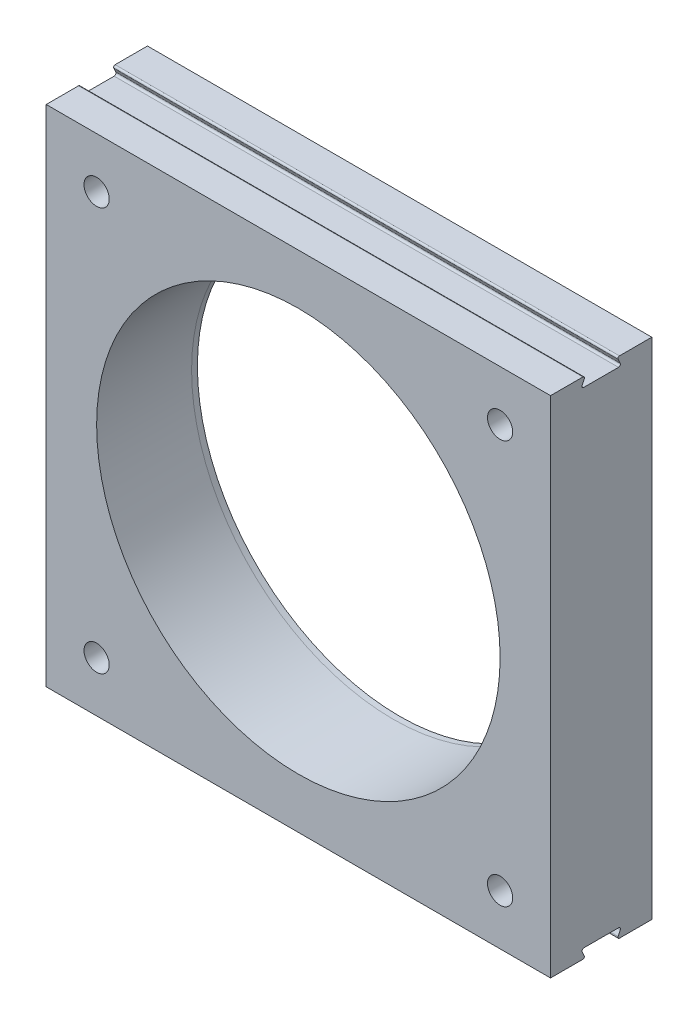
ISO-10303-21;
HEADER;
FILE_DESCRIPTION(('STEP AP214'),'2;1');
FILE_NAME('part.step','',(''),(''),'','','');
FILE_SCHEMA(('AUTOMOTIVE_DESIGN { 1 0 10303 214 1 1 1 1 }'));
ENDSEC;
DATA;
#1=APPLICATION_CONTEXT('core data for automotive mechanical design processes');
#2=APPLICATION_PROTOCOL_DEFINITION('international standard','automotive_design',2000,#1);
#3=PRODUCT_CONTEXT('',#1,'mechanical');
#4=PRODUCT('Part','Part','',(#3));
#5=PRODUCT_RELATED_PRODUCT_CATEGORY('part','',(#4));
#6=PRODUCT_DEFINITION_FORMATION('','',#4);
#7=PRODUCT_DEFINITION_CONTEXT('part definition',#1,'design');
#8=PRODUCT_DEFINITION('design','',#6,#7);
#9=PRODUCT_DEFINITION_SHAPE('','',#8);
#10=(LENGTH_UNIT() NAMED_UNIT(*) SI_UNIT(.MILLI.,.METRE.));
#11=(NAMED_UNIT(*) PLANE_ANGLE_UNIT() SI_UNIT($,.RADIAN.));
#12=(NAMED_UNIT(*) SI_UNIT($,.STERADIAN.) SOLID_ANGLE_UNIT());
#13=UNCERTAINTY_MEASURE_WITH_UNIT(LENGTH_MEASURE(1.E-05),#10,'distance_accuracy_value','');
#14=(GEOMETRIC_REPRESENTATION_CONTEXT(3) GLOBAL_UNCERTAINTY_ASSIGNED_CONTEXT((#13)) GLOBAL_UNIT_ASSIGNED_CONTEXT((#10,
#11,#12)) REPRESENTATION_CONTEXT('',''));
#15=CARTESIAN_POINT('',(0.,0.,0.));
#16=DIRECTION('',(0.,0.,1.));
#17=DIRECTION('',(1.,0.,0.));
#18=AXIS2_PLACEMENT_3D('',#15,#16,#17);
#19=CARTESIAN_POINT('',(-127.,-127.,25.5));
#20=DIRECTION('',(0.,0.,-1.));
#21=DIRECTION('',(-1.,0.,0.));
#22=AXIS2_PLACEMENT_3D('',#19,#20,#21);
#23=PLANE('',#22);
#24=CARTESIAN_POINT('',(0.,0.,25.5));
#25=DIRECTION('',(0.,0.,-1.));
#26=DIRECTION('',(-1.,0.,0.));
#27=AXIS2_PLACEMENT_3D('',#24,#25,#26);
#28=CIRCLE('',#27,101.6);
#29=CARTESIAN_POINT('',(-101.6,0.,25.5));
#30=VERTEX_POINT('',#29);
#31=EDGE_CURVE('E610',#30,#30,#28,.T.);
#32=ORIENTED_EDGE('',*,*,#31,.T.);
#33=EDGE_LOOP('',(#32));
#34=FACE_BOUND('',#33,.T.);
#35=CARTESIAN_POINT('',(101.6,-101.6,25.5));
#36=DIRECTION('',(0.,0.,1.));
#37=DIRECTION('',(-1.,0.,0.));
#38=AXIS2_PLACEMENT_3D('',#35,#36,#37);
#39=CIRCLE('',#38,6.34999999999999);
#40=CARTESIAN_POINT('',(95.25,-101.6,25.5));
#41=VERTEX_POINT('',#40);
#42=EDGE_CURVE('E581',#41,#41,#39,.T.);
#43=ORIENTED_EDGE('',*,*,#42,.F.);
#44=EDGE_LOOP('',(#43));
#45=FACE_BOUND('',#44,.T.);
#46=CARTESIAN_POINT('',(-101.6,-101.6,25.5));
#47=DIRECTION('',(0.,0.,-1.));
#48=DIRECTION('',(1.,0.,0.));
#49=AXIS2_PLACEMENT_3D('',#46,#47,#48);
#50=CIRCLE('',#49,6.34999999999999);
#51=CARTESIAN_POINT('',(-95.25,-101.6,25.5));
#52=VERTEX_POINT('',#51);
#53=EDGE_CURVE('E578',#52,#52,#50,.T.);
#54=ORIENTED_EDGE('',*,*,#53,.T.);
#55=EDGE_LOOP('',(#54));
#56=FACE_BOUND('',#55,.T.);
#57=CARTESIAN_POINT('',(-101.6,101.6,25.5));
#58=DIRECTION('',(0.,0.,1.));
#59=DIRECTION('',(1.,0.,0.));
#60=AXIS2_PLACEMENT_3D('',#57,#58,#59);
#61=CIRCLE('',#60,6.34999999999999);
#62=CARTESIAN_POINT('',(-95.25,101.6,25.5));
#63=VERTEX_POINT('',#62);
#64=EDGE_CURVE('E193',#63,#63,#61,.T.);
#65=ORIENTED_EDGE('',*,*,#64,.F.);
#66=EDGE_LOOP('',(#65));
#67=FACE_BOUND('',#66,.T.);
#68=DIRECTION('',(0.,-1.,0.));
#69=VECTOR('',#68,1.);
#70=CARTESIAN_POINT('',(-127.,127.,25.5));
#71=LINE('',#70,#69);
#72=CARTESIAN_POINT('',(-127.,127.,25.5));
#73=VERTEX_POINT('',#72);
#74=CARTESIAN_POINT('',(-127.,-127.,25.5));
#75=VERTEX_POINT('',#74);
#76=EDGE_CURVE('E274',#73,#75,#71,.T.);
#77=ORIENTED_EDGE('',*,*,#76,.T.);
#78=DIRECTION('',(-1.,0.,0.));
#79=VECTOR('',#78,1.);
#80=CARTESIAN_POINT('',(127.,-127.,25.5));
#81=LINE('',#80,#79);
#82=CARTESIAN_POINT('',(127.,-127.,25.5));
#83=VERTEX_POINT('',#82);
#84=EDGE_CURVE('E276',#83,#75,#81,.T.);
#85=ORIENTED_EDGE('',*,*,#84,.F.);
#86=DIRECTION('',(0.,1.,0.));
#87=VECTOR('',#86,1.);
#88=CARTESIAN_POINT('',(127.,-127.,25.5));
#89=LINE('',#88,#87);
#90=CARTESIAN_POINT('',(127.,127.,25.5));
#91=VERTEX_POINT('',#90);
#92=EDGE_CURVE('E280',#83,#91,#89,.T.);
#93=ORIENTED_EDGE('',*,*,#92,.T.);
#94=DIRECTION('',(1.,0.,0.));
#95=VECTOR('',#94,1.);
#96=CARTESIAN_POINT('',(-127.,127.,25.5));
#97=LINE('',#96,#95);
#98=EDGE_CURVE('E282',#73,#91,#97,.T.);
#99=ORIENTED_EDGE('',*,*,#98,.F.);
#100=EDGE_LOOP('',(#77,#85,#93,#99));
#101=FACE_BOUND('',#100,.T.);
#102=CARTESIAN_POINT('',(101.6,101.6,25.5));
#103=DIRECTION('',(0.,0.,-1.));
#104=DIRECTION('',(-1.,0.,0.));
#105=AXIS2_PLACEMENT_3D('',#102,#103,#104);
#106=CIRCLE('',#105,6.34999999999999);
#107=CARTESIAN_POINT('',(95.25,101.6,25.5));
#108=VERTEX_POINT('',#107);
#109=EDGE_CURVE('E572',#108,#108,#106,.T.);
#110=ORIENTED_EDGE('',*,*,#109,.T.);
#111=EDGE_LOOP('',(#110));
#112=FACE_BOUND('',#111,.T.);
#113=ADVANCED_FACE('F32',(#34,#45,#56,#67,#101,#112),#23,.F.);
#114=CARTESIAN_POINT('',(-127.,-127.,-25.5));
#115=DIRECTION('',(0.,0.,-1.));
#116=DIRECTION('',(-1.,0.,0.));
#117=AXIS2_PLACEMENT_3D('',#114,#115,#116);
#118=PLANE('',#117);
#119=CARTESIAN_POINT('',(0.,0.,-25.5));
#120=DIRECTION('',(0.,0.,-1.));
#121=DIRECTION('',(-1.,0.,0.));
#122=AXIS2_PLACEMENT_3D('',#119,#120,#121);
#123=CIRCLE('',#122,101.85);
#124=CARTESIAN_POINT('',(-101.85,0.,-25.5));
#125=VERTEX_POINT('',#124);
#126=EDGE_CURVE('E603',#125,#125,#123,.T.);
#127=ORIENTED_EDGE('',*,*,#126,.F.);
#128=EDGE_LOOP('',(#127));
#129=FACE_BOUND('',#128,.T.);
#130=CARTESIAN_POINT('',(101.6,-101.6,-25.5));
#131=DIRECTION('',(0.,0.,1.));
#132=DIRECTION('',(-1.,0.,0.));
#133=AXIS2_PLACEMENT_3D('',#130,#131,#132);
#134=CIRCLE('',#133,6.34999999999999);
#135=CARTESIAN_POINT('',(95.25,-101.6,-25.5));
#136=VERTEX_POINT('',#135);
#137=EDGE_CURVE('E575',#136,#136,#134,.T.);
#138=ORIENTED_EDGE('',*,*,#137,.T.);
#139=EDGE_LOOP('',(#138));
#140=FACE_BOUND('',#139,.T.);
#141=CARTESIAN_POINT('',(-101.6,-101.6,-25.5));
#142=DIRECTION('',(0.,0.,-1.));
#143=DIRECTION('',(1.,0.,0.));
#144=AXIS2_PLACEMENT_3D('',#141,#142,#143);
#145=CIRCLE('',#144,6.34999999999999);
#146=CARTESIAN_POINT('',(-95.25,-101.6,-25.5));
#147=VERTEX_POINT('',#146);
#148=EDGE_CURVE('E585',#147,#147,#145,.T.);
#149=ORIENTED_EDGE('',*,*,#148,.F.);
#150=EDGE_LOOP('',(#149));
#151=FACE_BOUND('',#150,.T.);
#152=CARTESIAN_POINT('',(-101.6,101.6,-25.5));
#153=DIRECTION('',(0.,0.,1.));
#154=DIRECTION('',(1.,0.,0.));
#155=AXIS2_PLACEMENT_3D('',#152,#153,#154);
#156=CIRCLE('',#155,6.34999999999999);
#157=CARTESIAN_POINT('',(-95.25,101.6,-25.5));
#158=VERTEX_POINT('',#157);
#159=EDGE_CURVE('E190',#158,#158,#156,.T.);
#160=ORIENTED_EDGE('',*,*,#159,.T.);
#161=EDGE_LOOP('',(#160));
#162=FACE_BOUND('',#161,.T.);
#163=DIRECTION('',(0.,-1.,0.));
#164=VECTOR('',#163,1.);
#165=CARTESIAN_POINT('',(-127.,127.,-25.5));
#166=LINE('',#165,#164);
#167=CARTESIAN_POINT('',(-127.,127.,-25.5));
#168=VERTEX_POINT('',#167);
#169=CARTESIAN_POINT('',(-127.,-127.,-25.5));
#170=VERTEX_POINT('',#169);
#171=EDGE_CURVE('E267',#168,#170,#166,.T.);
#172=ORIENTED_EDGE('',*,*,#171,.F.);
#173=DIRECTION('',(1.,0.,0.));
#174=VECTOR('',#173,1.);
#175=CARTESIAN_POINT('',(-127.,127.,-25.5));
#176=LINE('',#175,#174);
#177=CARTESIAN_POINT('',(127.,127.,-25.5));
#178=VERTEX_POINT('',#177);
#179=EDGE_CURVE('E277',#168,#178,#176,.T.);
#180=ORIENTED_EDGE('',*,*,#179,.T.);
#181=DIRECTION('',(0.,1.,0.));
#182=VECTOR('',#181,1.);
#183=CARTESIAN_POINT('',(127.,-127.,-25.5));
#184=LINE('',#183,#182);
#185=CARTESIAN_POINT('',(127.,-127.,-25.5));
#186=VERTEX_POINT('',#185);
#187=EDGE_CURVE('E290',#186,#178,#184,.T.);
#188=ORIENTED_EDGE('',*,*,#187,.F.);
#189=DIRECTION('',(-1.,0.,0.));
#190=VECTOR('',#189,1.);
#191=CARTESIAN_POINT('',(127.,-127.,-25.5));
#192=LINE('',#191,#190);
#193=EDGE_CURVE('E287',#186,#170,#192,.T.);
#194=ORIENTED_EDGE('',*,*,#193,.T.);
#195=EDGE_LOOP('',(#172,#180,#188,#194));
#196=FACE_BOUND('',#195,.T.);
#197=CARTESIAN_POINT('',(101.6,101.6,-25.5));
#198=DIRECTION('',(0.,0.,-1.));
#199=DIRECTION('',(-1.,0.,0.));
#200=AXIS2_PLACEMENT_3D('',#197,#198,#199);
#201=CIRCLE('',#200,6.34999999999999);
#202=CARTESIAN_POINT('',(95.25,101.6,-25.5));
#203=VERTEX_POINT('',#202);
#204=EDGE_CURVE('E574',#203,#203,#201,.T.);
#205=ORIENTED_EDGE('',*,*,#204,.F.);
#206=EDGE_LOOP('',(#205));
#207=FACE_BOUND('',#206,.T.);
#208=ADVANCED_FACE('F336',(#129,#140,#151,#162,#196,#207),#118,.T.);
#209=CARTESIAN_POINT('',(-127.,127.,25.5));
#210=DIRECTION('',(1.,0.,0.));
#211=DIRECTION('',(0.,1.,0.));
#212=AXIS2_PLACEMENT_3D('',#209,#210,#211);
#213=PLANE('',#212);
#214=CARTESIAN_POINT('',(-127.,-126.20625,9.20803888963356));
#215=DIRECTION('',(-1.,0.,0.));
#216=DIRECTION('',(0.,-1.,0.));
#217=AXIS2_PLACEMENT_3D('',#214,#215,#216);
#218=CIRCLE('',#217,0.79375);
#219=CARTESIAN_POINT('',(-127.,-127.,9.20803888963356));
#220=VERTEX_POINT('',#219);
#221=CARTESIAN_POINT('',(-127.,-125.858154942476,8.49468841936867));
#222=VERTEX_POINT('',#221);
#223=EDGE_CURVE('E232',#220,#222,#218,.F.);
#224=ORIENTED_EDGE('',*,*,#223,.F.);
#225=DIRECTION('',(0.,0.,-1.));
#226=VECTOR('',#225,1.);
#227=CARTESIAN_POINT('',(-127.,-127.,25.5));
#228=LINE('',#227,#226);
#229=EDGE_CURVE('E306',#75,#220,#228,.T.);
#230=ORIENTED_EDGE('',*,*,#229,.F.);
#231=ORIENTED_EDGE('',*,*,#76,.F.);
#232=DIRECTION('',(0.,0.,-1.));
#233=VECTOR('',#232,1.);
#234=CARTESIAN_POINT('',(-127.,127.,25.5));
#235=LINE('',#234,#233);
#236=CARTESIAN_POINT('',(-127.,127.,9.20803888963356));
#237=VERTEX_POINT('',#236);
#238=EDGE_CURVE('E295',#73,#237,#235,.T.);
#239=ORIENTED_EDGE('',*,*,#238,.T.);
#240=CARTESIAN_POINT('',(-127.,126.20625,9.20803888963356));
#241=DIRECTION('',(1.,0.,0.));
#242=DIRECTION('',(0.,1.,0.));
#243=AXIS2_PLACEMENT_3D('',#240,#241,#242);
#244=CIRCLE('',#243,0.79375);
#245=CARTESIAN_POINT('',(-127.,125.858154942476,8.49468841936867));
#246=VERTEX_POINT('',#245);
#247=EDGE_CURVE('E319',#237,#246,#244,.F.);
#248=ORIENTED_EDGE('',*,*,#247,.T.);
#249=DIRECTION('',(0.,-0.898709253877024,0.438544954361354));
#250=VECTOR('',#249,1.);
#251=CARTESIAN_POINT('',(-127.,127.,7.9375));
#252=LINE('',#251,#250);
#253=CARTESIAN_POINT('',(-127.,123.612719874881,9.59039786599067));
#254=VERTEX_POINT('',#253);
#255=EDGE_CURVE('E240',#246,#254,#252,.T.);
#256=ORIENTED_EDGE('',*,*,#255,.T.);
#257=CARTESIAN_POINT('',(-127.,123.193479770192,8.73125));
#258=DIRECTION('',(1.,0.,0.));
#259=DIRECTION('',(0.,0.,-1.));
#260=AXIS2_PLACEMENT_3D('',#257,#258,#259);
#261=CIRCLE('',#260,0.955979770191875);
#262=CARTESIAN_POINT('',(-127.,122.2375,8.73125));
#263=VERTEX_POINT('',#262);
#264=EDGE_CURVE('E242',#254,#263,#261,.T.);
#265=ORIENTED_EDGE('',*,*,#264,.T.);
#266=DIRECTION('',(0.,0.,1.));
#267=VECTOR('',#266,1.);
#268=CARTESIAN_POINT('',(-127.,122.2375,-8.73125));
#269=LINE('',#268,#267);
#270=CARTESIAN_POINT('',(-127.,122.2375,-8.73125));
#271=VERTEX_POINT('',#270);
#272=EDGE_CURVE('E246',#271,#263,#269,.T.);
#273=ORIENTED_EDGE('',*,*,#272,.F.);
#274=CARTESIAN_POINT('',(-127.,123.193479770192,-8.73125));
#275=DIRECTION('',(-1.,0.,0.));
#276=DIRECTION('',(0.,0.,1.));
#277=AXIS2_PLACEMENT_3D('',#274,#275,#276);
#278=CIRCLE('',#277,0.955979770191875);
#279=CARTESIAN_POINT('',(-127.,123.612719874881,-9.59039786599068));
#280=VERTEX_POINT('',#279);
#281=EDGE_CURVE('E248',#280,#271,#278,.T.);
#282=ORIENTED_EDGE('',*,*,#281,.F.);
#283=DIRECTION('',(0.,-0.898709253877024,-0.438544954361354));
#284=VECTOR('',#283,1.);
#285=CARTESIAN_POINT('',(-127.,127.,-7.9375));
#286=LINE('',#285,#284);
#287=CARTESIAN_POINT('',(-127.,125.858154942476,-8.49468841936868));
#288=VERTEX_POINT('',#287);
#289=EDGE_CURVE('E250',#288,#280,#286,.T.);
#290=ORIENTED_EDGE('',*,*,#289,.F.);
#291=CARTESIAN_POINT('',(-127.,126.20625,-9.20803888963357));
#292=DIRECTION('',(1.,0.,0.));
#293=DIRECTION('',(0.,1.,0.));
#294=AXIS2_PLACEMENT_3D('',#291,#292,#293);
#295=CIRCLE('',#294,0.79375);
#296=CARTESIAN_POINT('',(-127.,127.,-9.20803888963357));
#297=VERTEX_POINT('',#296);
#298=EDGE_CURVE('E55',#288,#297,#295,.F.);
#299=ORIENTED_EDGE('',*,*,#298,.T.);
#300=EDGE_CURVE('E285',#297,#168,#235,.T.);
#301=ORIENTED_EDGE('',*,*,#300,.T.);
#302=ORIENTED_EDGE('',*,*,#171,.T.);
#303=CARTESIAN_POINT('',(-127.,-127.,-9.20803888963357));
#304=VERTEX_POINT('',#303);
#305=EDGE_CURVE('E189',#304,#170,#228,.T.);
#306=ORIENTED_EDGE('',*,*,#305,.F.);
#307=CARTESIAN_POINT('',(-127.,-126.20625,-9.20803888963357));
#308=DIRECTION('',(-1.,0.,0.));
#309=DIRECTION('',(0.,-1.,0.));
#310=AXIS2_PLACEMENT_3D('',#307,#308,#309);
#311=CIRCLE('',#310,0.79375);
#312=CARTESIAN_POINT('',(-127.,-125.858154942476,-8.49468841936868));
#313=VERTEX_POINT('',#312);
#314=EDGE_CURVE('E171',#313,#304,#311,.F.);
#315=ORIENTED_EDGE('',*,*,#314,.F.);
#316=DIRECTION('',(0.,0.898709253877024,-0.438544954361354));
#317=VECTOR('',#316,1.);
#318=CARTESIAN_POINT('',(-127.,-127.,-7.9375));
#319=LINE('',#318,#317);
#320=CARTESIAN_POINT('',(-127.,-123.612719874881,-9.59039786599068));
#321=VERTEX_POINT('',#320);
#322=EDGE_CURVE('E178',#313,#321,#319,.T.);
#323=ORIENTED_EDGE('',*,*,#322,.T.);
#324=CARTESIAN_POINT('',(-127.,-123.193479770192,-8.73125));
#325=DIRECTION('',(1.,0.,0.));
#326=DIRECTION('',(0.,0.,1.));
#327=AXIS2_PLACEMENT_3D('',#324,#325,#326);
#328=CIRCLE('',#327,0.955979770191875);
#329=CARTESIAN_POINT('',(-127.,-122.2375,-8.73125));
#330=VERTEX_POINT('',#329);
#331=EDGE_CURVE('E204',#321,#330,#328,.T.);
#332=ORIENTED_EDGE('',*,*,#331,.T.);
#333=DIRECTION('',(0.,0.,1.));
#334=VECTOR('',#333,1.);
#335=CARTESIAN_POINT('',(-127.,-122.2375,-8.73125));
#336=LINE('',#335,#334);
#337=CARTESIAN_POINT('',(-127.,-122.2375,8.73125));
#338=VERTEX_POINT('',#337);
#339=EDGE_CURVE('E211',#330,#338,#336,.T.);
#340=ORIENTED_EDGE('',*,*,#339,.T.);
#341=CARTESIAN_POINT('',(-127.,-123.193479770192,8.73125));
#342=DIRECTION('',(-1.,0.,0.));
#343=DIRECTION('',(0.,0.,-1.));
#344=AXIS2_PLACEMENT_3D('',#341,#342,#343);
#345=CIRCLE('',#344,0.955979770191875);
#346=CARTESIAN_POINT('',(-127.,-123.612719874881,9.59039786599067));
#347=VERTEX_POINT('',#346);
#348=EDGE_CURVE('E219',#347,#338,#345,.T.);
#349=ORIENTED_EDGE('',*,*,#348,.F.);
#350=DIRECTION('',(0.,0.898709253877024,0.438544954361354));
#351=VECTOR('',#350,1.);
#352=CARTESIAN_POINT('',(-127.,-127.,7.9375));
#353=LINE('',#352,#351);
#354=EDGE_CURVE('E224',#222,#347,#353,.T.);
#355=ORIENTED_EDGE('',*,*,#354,.F.);
#356=EDGE_LOOP('',(#224,#230,#231,#239,#248,#256,#265,#273,#282,#290,#299,#301,#302,#306,#315,
#323,#332,#340,#349,#355));
#357=FACE_BOUND('',#356,.T.);
#358=ADVANCED_FACE('F187',(#357),#213,.F.);
#359=CARTESIAN_POINT('',(127.,-127.,25.5));
#360=DIRECTION('',(0.,-1.,0.));
#361=DIRECTION('',(1.,0.,0.));
#362=AXIS2_PLACEMENT_3D('',#359,#360,#361);
#363=PLANE('',#362);
#364=DIRECTION('',(1.,0.,0.));
#365=VECTOR('',#364,1.);
#366=CARTESIAN_POINT('',(-127.,-127.,9.20803888963356));
#367=LINE('',#366,#365);
#368=CARTESIAN_POINT('',(127.,-127.,9.20803888963356));
#369=VERTEX_POINT('',#368);
#370=EDGE_CURVE('E235',#369,#220,#367,.F.);
#371=ORIENTED_EDGE('',*,*,#370,.F.);
#372=DIRECTION('',(0.,0.,-1.));
#373=VECTOR('',#372,1.);
#374=CARTESIAN_POINT('',(127.,-127.,25.5));
#375=LINE('',#374,#373);
#376=EDGE_CURVE('E303',#83,#369,#375,.T.);
#377=ORIENTED_EDGE('',*,*,#376,.F.);
#378=ORIENTED_EDGE('',*,*,#84,.T.);
#379=ORIENTED_EDGE('',*,*,#229,.T.);
#380=EDGE_LOOP('',(#371,#377,#378,#379));
#381=FACE_BOUND('',#380,.T.);
#382=ADVANCED_FACE('F343',(#381),#363,.T.);
#383=CARTESIAN_POINT('',(127.,-127.,25.5));
#384=DIRECTION('',(-1.,0.,0.));
#385=DIRECTION('',(0.,-1.,0.));
#386=AXIS2_PLACEMENT_3D('',#383,#384,#385);
#387=PLANE('',#386);
#388=CARTESIAN_POINT('',(127.,-126.20625,9.20803888963356));
#389=DIRECTION('',(1.,0.,0.));
#390=DIRECTION('',(0.,1.,0.));
#391=AXIS2_PLACEMENT_3D('',#388,#389,#390);
#392=CIRCLE('',#391,0.79375);
#393=CARTESIAN_POINT('',(127.,-125.858154942476,8.49468841936867));
#394=VERTEX_POINT('',#393);
#395=EDGE_CURVE('E237',#394,#369,#392,.F.);
#396=ORIENTED_EDGE('',*,*,#395,.F.);
#397=DIRECTION('',(0.,0.898709253877024,0.438544954361354));
#398=VECTOR('',#397,1.);
#399=CARTESIAN_POINT('',(127.,-127.,7.9375));
#400=LINE('',#399,#398);
#401=CARTESIAN_POINT('',(127.,-123.612719874881,9.59039786599067));
#402=VERTEX_POINT('',#401);
#403=EDGE_CURVE('E229',#394,#402,#400,.T.);
#404=ORIENTED_EDGE('',*,*,#403,.T.);
#405=CARTESIAN_POINT('',(127.,-123.193479770192,8.73125));
#406=DIRECTION('',(-1.,0.,0.));
#407=DIRECTION('',(0.,0.,-1.));
#408=AXIS2_PLACEMENT_3D('',#405,#406,#407);
#409=CIRCLE('',#408,0.955979770191875);
#410=CARTESIAN_POINT('',(127.,-122.2375,8.73125));
#411=VERTEX_POINT('',#410);
#412=EDGE_CURVE('E216',#402,#411,#409,.T.);
#413=ORIENTED_EDGE('',*,*,#412,.T.);
#414=DIRECTION('',(0.,0.,1.));
#415=VECTOR('',#414,1.);
#416=CARTESIAN_POINT('',(127.,-122.2375,-8.73125));
#417=LINE('',#416,#415);
#418=CARTESIAN_POINT('',(127.,-122.2375,-8.73125));
#419=VERTEX_POINT('',#418);
#420=EDGE_CURVE('E208',#419,#411,#417,.T.);
#421=ORIENTED_EDGE('',*,*,#420,.F.);
#422=CARTESIAN_POINT('',(127.,-123.193479770192,-8.73125));
#423=DIRECTION('',(1.,0.,0.));
#424=DIRECTION('',(0.,0.,1.));
#425=AXIS2_PLACEMENT_3D('',#422,#423,#424);
#426=CIRCLE('',#425,0.955979770191875);
#427=CARTESIAN_POINT('',(127.,-123.612719874881,-9.59039786599068));
#428=VERTEX_POINT('',#427);
#429=EDGE_CURVE('E201',#428,#419,#426,.T.);
#430=ORIENTED_EDGE('',*,*,#429,.F.);
#431=DIRECTION('',(0.,0.898709253877024,-0.438544954361354));
#432=VECTOR('',#431,1.);
#433=CARTESIAN_POINT('',(127.,-127.,-7.9375));
#434=LINE('',#433,#432);
#435=CARTESIAN_POINT('',(127.,-125.858154942476,-8.49468841936868));
#436=VERTEX_POINT('',#435);
#437=EDGE_CURVE('E183',#436,#428,#434,.T.);
#438=ORIENTED_EDGE('',*,*,#437,.F.);
#439=CARTESIAN_POINT('',(127.,-126.20625,-9.20803888963357));
#440=DIRECTION('',(1.,0.,0.));
#441=DIRECTION('',(0.,1.,0.));
#442=AXIS2_PLACEMENT_3D('',#439,#440,#441);
#443=CIRCLE('',#442,0.79375);
#444=CARTESIAN_POINT('',(127.,-127.,-9.20803888963357));
#445=VERTEX_POINT('',#444);
#446=EDGE_CURVE('E172',#445,#436,#443,.F.);
#447=ORIENTED_EDGE('',*,*,#446,.F.);
#448=EDGE_CURVE('E302',#445,#186,#375,.T.);
#449=ORIENTED_EDGE('',*,*,#448,.T.);
#450=ORIENTED_EDGE('',*,*,#187,.T.);
#451=DIRECTION('',(0.,0.,-1.));
#452=VECTOR('',#451,1.);
#453=CARTESIAN_POINT('',(127.,127.,25.5));
#454=LINE('',#453,#452);
#455=CARTESIAN_POINT('',(127.,127.,-9.20803888963357));
#456=VERTEX_POINT('',#455);
#457=EDGE_CURVE('E298',#456,#178,#454,.T.);
#458=ORIENTED_EDGE('',*,*,#457,.F.);
#459=CARTESIAN_POINT('',(127.,126.20625,-9.20803888963357));
#460=DIRECTION('',(-1.,0.,0.));
#461=DIRECTION('',(0.,-1.,0.));
#462=AXIS2_PLACEMENT_3D('',#459,#460,#461);
#463=CIRCLE('',#462,0.79375);
#464=CARTESIAN_POINT('',(127.,125.858154942476,-8.49468841936868));
#465=VERTEX_POINT('',#464);
#466=EDGE_CURVE('E312',#456,#465,#463,.F.);
#467=ORIENTED_EDGE('',*,*,#466,.T.);
#468=DIRECTION('',(0.,-0.898709253877024,-0.438544954361354));
#469=VECTOR('',#468,1.);
#470=CARTESIAN_POINT('',(127.,127.,-7.9375));
#471=LINE('',#470,#469);
#472=CARTESIAN_POINT('',(127.,123.612719874881,-9.59039786599068));
#473=VERTEX_POINT('',#472);
#474=EDGE_CURVE('E243',#465,#473,#471,.T.);
#475=ORIENTED_EDGE('',*,*,#474,.T.);
#476=CARTESIAN_POINT('',(127.,123.193479770192,-8.73125));
#477=DIRECTION('',(-1.,0.,0.));
#478=DIRECTION('',(0.,0.,1.));
#479=AXIS2_PLACEMENT_3D('',#476,#477,#478);
#480=CIRCLE('',#479,0.955979770191875);
#481=CARTESIAN_POINT('',(127.,122.2375,-8.73125));
#482=VERTEX_POINT('',#481);
#483=EDGE_CURVE('E260',#473,#482,#480,.T.);
#484=ORIENTED_EDGE('',*,*,#483,.T.);
#485=DIRECTION('',(0.,0.,1.));
#486=VECTOR('',#485,1.);
#487=CARTESIAN_POINT('',(127.,122.2375,-8.73125));
#488=LINE('',#487,#486);
#489=CARTESIAN_POINT('',(127.,122.2375,8.73125));
#490=VERTEX_POINT('',#489);
#491=EDGE_CURVE('E257',#482,#490,#488,.T.);
#492=ORIENTED_EDGE('',*,*,#491,.T.);
#493=CARTESIAN_POINT('',(127.,123.193479770192,8.73125));
#494=DIRECTION('',(1.,0.,0.));
#495=DIRECTION('',(0.,0.,-1.));
#496=AXIS2_PLACEMENT_3D('',#493,#494,#495);
#497=CIRCLE('',#496,0.955979770191875);
#498=CARTESIAN_POINT('',(127.,123.612719874881,9.59039786599067));
#499=VERTEX_POINT('',#498);
#500=EDGE_CURVE('E254',#499,#490,#497,.T.);
#501=ORIENTED_EDGE('',*,*,#500,.F.);
#502=DIRECTION('',(0.,-0.898709253877024,0.438544954361354));
#503=VECTOR('',#502,1.);
#504=CARTESIAN_POINT('',(127.,127.,7.9375));
#505=LINE('',#504,#503);
#506=CARTESIAN_POINT('',(127.,125.858154942476,8.49468841936867));
#507=VERTEX_POINT('',#506);
#508=EDGE_CURVE('E239',#507,#499,#505,.T.);
#509=ORIENTED_EDGE('',*,*,#508,.F.);
#510=CARTESIAN_POINT('',(127.,126.20625,9.20803888963356));
#511=DIRECTION('',(-1.,0.,0.));
#512=DIRECTION('',(0.,-1.,0.));
#513=AXIS2_PLACEMENT_3D('',#510,#511,#512);
#514=CIRCLE('',#513,0.79375);
#515=CARTESIAN_POINT('',(127.,127.,9.20803888963356));
#516=VERTEX_POINT('',#515);
#517=EDGE_CURVE('E314',#507,#516,#514,.F.);
#518=ORIENTED_EDGE('',*,*,#517,.T.);
#519=EDGE_CURVE('E299',#91,#516,#454,.T.);
#520=ORIENTED_EDGE('',*,*,#519,.F.);
#521=ORIENTED_EDGE('',*,*,#92,.F.);
#522=ORIENTED_EDGE('',*,*,#376,.T.);
#523=EDGE_LOOP('',(#396,#404,#413,#421,#430,#438,#447,#449,#450,#458,#467,#475,#484,#492,#501,
#509,#518,#520,#521,#522));
#524=FACE_BOUND('',#523,.T.);
#525=ADVANCED_FACE('F329',(#524),#387,.F.);
#526=CARTESIAN_POINT('',(-127.,127.,25.5));
#527=DIRECTION('',(0.,1.,0.));
#528=DIRECTION('',(-1.,0.,0.));
#529=AXIS2_PLACEMENT_3D('',#526,#527,#528);
#530=PLANE('',#529);
#531=ORIENTED_EDGE('',*,*,#300,.F.);
#532=DIRECTION('',(1.,0.,0.));
#533=VECTOR('',#532,1.);
#534=CARTESIAN_POINT('',(-127.,127.,-9.20803888963357));
#535=LINE('',#534,#533);
#536=EDGE_CURVE('E40',#297,#456,#535,.T.);
#537=ORIENTED_EDGE('',*,*,#536,.T.);
#538=ORIENTED_EDGE('',*,*,#457,.T.);
#539=ORIENTED_EDGE('',*,*,#179,.F.);
#540=EDGE_LOOP('',(#531,#537,#538,#539));
#541=FACE_BOUND('',#540,.T.);
#542=ADVANCED_FACE('F324',(#541),#530,.T.);
#543=DIRECTION('',(1.,0.,0.));
#544=VECTOR('',#543,1.);
#545=CARTESIAN_POINT('',(-127.,-127.,-9.20803888963357));
#546=LINE('',#545,#544);
#547=EDGE_CURVE('E47',#304,#445,#546,.T.);
#548=ORIENTED_EDGE('',*,*,#547,.F.);
#549=ORIENTED_EDGE('',*,*,#305,.T.);
#550=ORIENTED_EDGE('',*,*,#193,.F.);
#551=ORIENTED_EDGE('',*,*,#448,.F.);
#552=EDGE_LOOP('',(#548,#549,#550,#551));
#553=FACE_BOUND('',#552,.T.);
#554=ADVANCED_FACE('F339',(#553),#363,.T.);
#555=ORIENTED_EDGE('',*,*,#519,.T.);
#556=DIRECTION('',(1.,0.,0.));
#557=VECTOR('',#556,1.);
#558=CARTESIAN_POINT('',(-127.,127.,9.20803888963356));
#559=LINE('',#558,#557);
#560=EDGE_CURVE('E316',#516,#237,#559,.F.);
#561=ORIENTED_EDGE('',*,*,#560,.T.);
#562=ORIENTED_EDGE('',*,*,#238,.F.);
#563=ORIENTED_EDGE('',*,*,#98,.T.);
#564=EDGE_LOOP('',(#555,#561,#562,#563));
#565=FACE_BOUND('',#564,.T.);
#566=ADVANCED_FACE('F341',(#565),#530,.T.);
#567=CARTESIAN_POINT('',(-127.,127.,7.9375));
#568=DIRECTION('',(0.,0.438544954361354,0.898709253877025));
#569=DIRECTION('',(0.,-0.898709253877025,0.438544954361354));
#570=AXIS2_PLACEMENT_3D('',#567,#568,#569);
#571=PLANE('',#570);
#572=ORIENTED_EDGE('',*,*,#255,.F.);
#573=DIRECTION('',(1.,0.,0.));
#574=VECTOR('',#573,1.);
#575=CARTESIAN_POINT('',(127.,125.858154942476,8.49468841936867));
#576=LINE('',#575,#574);
#577=EDGE_CURVE('E309',#246,#507,#576,.T.);
#578=ORIENTED_EDGE('',*,*,#577,.T.);
#579=ORIENTED_EDGE('',*,*,#508,.T.);
#580=DIRECTION('',(1.,0.,0.));
#581=VECTOR('',#580,1.);
#582=CARTESIAN_POINT('',(-127.,123.612719874881,9.59039786599067));
#583=LINE('',#582,#581);
#584=EDGE_CURVE('E252',#254,#499,#583,.T.);
#585=ORIENTED_EDGE('',*,*,#584,.F.);
#586=EDGE_LOOP('',(#572,#578,#579,#585));
#587=FACE_BOUND('',#586,.T.);
#588=ADVANCED_FACE('F348',(#587),#571,.F.);
#589=CARTESIAN_POINT('',(-127.,127.,-7.9375));
#590=DIRECTION('',(0.,-0.438544954361354,0.898709253877025));
#591=DIRECTION('',(0.,-0.898709253877025,-0.438544954361354));
#592=AXIS2_PLACEMENT_3D('',#589,#590,#591);
#593=PLANE('',#592);
#594=ORIENTED_EDGE('',*,*,#474,.F.);
#595=DIRECTION('',(1.,0.,0.));
#596=VECTOR('',#595,1.);
#597=CARTESIAN_POINT('',(-127.,125.858154942476,-8.49468841936868));
#598=LINE('',#597,#596);
#599=EDGE_CURVE('E11',#465,#288,#598,.F.);
#600=ORIENTED_EDGE('',*,*,#599,.T.);
#601=ORIENTED_EDGE('',*,*,#289,.T.);
#602=DIRECTION('',(1.,0.,0.));
#603=VECTOR('',#602,1.);
#604=CARTESIAN_POINT('',(-127.,123.612719874881,-9.59039786599068));
#605=LINE('',#604,#603);
#606=EDGE_CURVE('E264',#280,#473,#605,.T.);
#607=ORIENTED_EDGE('',*,*,#606,.T.);
#608=EDGE_LOOP('',(#594,#600,#601,#607));
#609=FACE_BOUND('',#608,.T.);
#610=ADVANCED_FACE('F399',(#609),#593,.T.);
#611=CARTESIAN_POINT('',(-127.,123.193479770192,-8.73125));
#612=DIRECTION('',(1.,0.,0.));
#613=DIRECTION('',(0.,1.,0.));
#614=AXIS2_PLACEMENT_3D('',#611,#612,#613);
#615=CYLINDRICAL_SURFACE('',#614,0.955979770191875);
#616=ORIENTED_EDGE('',*,*,#483,.F.);
#617=ORIENTED_EDGE('',*,*,#606,.F.);
#618=ORIENTED_EDGE('',*,*,#281,.T.);
#619=DIRECTION('',(1.,0.,0.));
#620=VECTOR('',#619,1.);
#621=CARTESIAN_POINT('',(-127.,122.2375,-8.73125));
#622=LINE('',#621,#620);
#623=EDGE_CURVE('E268',#271,#482,#622,.T.);
#624=ORIENTED_EDGE('',*,*,#623,.T.);
#625=EDGE_LOOP('',(#616,#617,#618,#624));
#626=FACE_BOUND('',#625,.T.);
#627=ADVANCED_FACE('F408',(#626),#615,.F.);
#628=CARTESIAN_POINT('',(-127.,122.2375,-8.73125));
#629=DIRECTION('',(0.,1.,0.));
#630=DIRECTION('',(-1.,0.,0.));
#631=AXIS2_PLACEMENT_3D('',#628,#629,#630);
#632=PLANE('',#631);
#633=ORIENTED_EDGE('',*,*,#491,.F.);
#634=ORIENTED_EDGE('',*,*,#623,.F.);
#635=ORIENTED_EDGE('',*,*,#272,.T.);
#636=DIRECTION('',(1.,0.,0.));
#637=VECTOR('',#636,1.);
#638=CARTESIAN_POINT('',(-127.,122.2375,8.73125));
#639=LINE('',#638,#637);
#640=EDGE_CURVE('E270',#263,#490,#639,.T.);
#641=ORIENTED_EDGE('',*,*,#640,.T.);
#642=EDGE_LOOP('',(#633,#634,#635,#641));
#643=FACE_BOUND('',#642,.T.);
#644=ADVANCED_FACE('F534',(#643),#632,.T.);
#645=CARTESIAN_POINT('',(-127.,123.193479770192,8.73125));
#646=DIRECTION('',(1.,0.,0.));
#647=DIRECTION('',(0.,1.,0.));
#648=AXIS2_PLACEMENT_3D('',#645,#646,#647);
#649=CYLINDRICAL_SURFACE('',#648,0.955979770191875);
#650=ORIENTED_EDGE('',*,*,#500,.T.);
#651=ORIENTED_EDGE('',*,*,#640,.F.);
#652=ORIENTED_EDGE('',*,*,#264,.F.);
#653=ORIENTED_EDGE('',*,*,#584,.T.);
#654=EDGE_LOOP('',(#650,#651,#652,#653));
#655=FACE_BOUND('',#654,.T.);
#656=ADVANCED_FACE('F385',(#655),#649,.F.);
#657=CARTESIAN_POINT('',(-127.,126.20625,9.20803888963356));
#658=DIRECTION('',(-1.,0.,0.));
#659=DIRECTION('',(0.,-1.,0.));
#660=AXIS2_PLACEMENT_3D('',#657,#658,#659);
#661=CYLINDRICAL_SURFACE('',#660,0.79375);
#662=ORIENTED_EDGE('',*,*,#247,.F.);
#663=ORIENTED_EDGE('',*,*,#560,.F.);
#664=ORIENTED_EDGE('',*,*,#517,.F.);
#665=ORIENTED_EDGE('',*,*,#577,.F.);
#666=EDGE_LOOP('',(#662,#663,#664,#665));
#667=FACE_BOUND('',#666,.T.);
#668=ADVANCED_FACE('F416',(#667),#661,.T.);
#669=CARTESIAN_POINT('',(-127.,126.20625,-9.20803888963357));
#670=DIRECTION('',(1.,0.,0.));
#671=DIRECTION('',(0.,1.,0.));
#672=AXIS2_PLACEMENT_3D('',#669,#670,#671);
#673=CYLINDRICAL_SURFACE('',#672,0.79375);
#674=ORIENTED_EDGE('',*,*,#298,.F.);
#675=ORIENTED_EDGE('',*,*,#599,.F.);
#676=ORIENTED_EDGE('',*,*,#466,.F.);
#677=ORIENTED_EDGE('',*,*,#536,.F.);
#678=EDGE_LOOP('',(#674,#675,#676,#677));
#679=FACE_BOUND('',#678,.T.);
#680=ADVANCED_FACE('F34',(#679),#673,.T.);
#681=CARTESIAN_POINT('',(-127.,-126.20625,9.20803888963356));
#682=DIRECTION('',(-1.,0.,0.));
#683=DIRECTION('',(0.,1.,0.));
#684=AXIS2_PLACEMENT_3D('',#681,#682,#683);
#685=CYLINDRICAL_SURFACE('',#684,0.79375);
#686=ORIENTED_EDGE('',*,*,#223,.T.);
#687=DIRECTION('',(1.,0.,0.));
#688=VECTOR('',#687,1.);
#689=CARTESIAN_POINT('',(127.,-125.858154942476,8.49468841936867));
#690=LINE('',#689,#688);
#691=EDGE_CURVE('E227',#222,#394,#690,.T.);
#692=ORIENTED_EDGE('',*,*,#691,.T.);
#693=ORIENTED_EDGE('',*,*,#395,.T.);
#694=ORIENTED_EDGE('',*,*,#370,.T.);
#695=EDGE_LOOP('',(#686,#692,#693,#694));
#696=FACE_BOUND('',#695,.T.);
#697=ADVANCED_FACE('F429',(#696),#685,.T.);
#698=CARTESIAN_POINT('',(-127.,-127.,7.9375));
#699=DIRECTION('',(0.,-0.438544954361354,0.898709253877025));
#700=DIRECTION('',(0.,0.898709253877025,0.438544954361354));
#701=AXIS2_PLACEMENT_3D('',#698,#699,#700);
#702=PLANE('',#701);
#703=ORIENTED_EDGE('',*,*,#354,.T.);
#704=DIRECTION('',(1.,0.,0.));
#705=VECTOR('',#704,1.);
#706=CARTESIAN_POINT('',(-127.,-123.612719874881,9.59039786599067));
#707=LINE('',#706,#705);
#708=EDGE_CURVE('E222',#347,#402,#707,.T.);
#709=ORIENTED_EDGE('',*,*,#708,.T.);
#710=ORIENTED_EDGE('',*,*,#403,.F.);
#711=ORIENTED_EDGE('',*,*,#691,.F.);
#712=EDGE_LOOP('',(#703,#709,#710,#711));
#713=FACE_BOUND('',#712,.T.);
#714=ADVANCED_FACE('F526',(#713),#702,.F.);
#715=CARTESIAN_POINT('',(-127.,-123.193479770192,8.73125));
#716=DIRECTION('',(1.,0.,0.));
#717=DIRECTION('',(0.,-1.,0.));
#718=AXIS2_PLACEMENT_3D('',#715,#716,#717);
#719=CYLINDRICAL_SURFACE('',#718,0.955979770191875);
#720=ORIENTED_EDGE('',*,*,#412,.F.);
#721=ORIENTED_EDGE('',*,*,#708,.F.);
#722=ORIENTED_EDGE('',*,*,#348,.T.);
#723=DIRECTION('',(1.,0.,0.));
#724=VECTOR('',#723,1.);
#725=CARTESIAN_POINT('',(-127.,-122.2375,8.73125));
#726=LINE('',#725,#724);
#727=EDGE_CURVE('E214',#338,#411,#726,.T.);
#728=ORIENTED_EDGE('',*,*,#727,.T.);
#729=EDGE_LOOP('',(#720,#721,#722,#728));
#730=FACE_BOUND('',#729,.T.);
#731=ADVANCED_FACE('F522',(#730),#719,.F.);
#732=CARTESIAN_POINT('',(-127.,-122.2375,-8.73125));
#733=DIRECTION('',(0.,-1.,0.));
#734=DIRECTION('',(-1.,0.,0.));
#735=AXIS2_PLACEMENT_3D('',#732,#733,#734);
#736=PLANE('',#735);
#737=ORIENTED_EDGE('',*,*,#420,.T.);
#738=ORIENTED_EDGE('',*,*,#727,.F.);
#739=ORIENTED_EDGE('',*,*,#339,.F.);
#740=DIRECTION('',(1.,0.,0.));
#741=VECTOR('',#740,1.);
#742=CARTESIAN_POINT('',(-127.,-122.2375,-8.73125));
#743=LINE('',#742,#741);
#744=EDGE_CURVE('E206',#330,#419,#743,.T.);
#745=ORIENTED_EDGE('',*,*,#744,.T.);
#746=EDGE_LOOP('',(#737,#738,#739,#745));
#747=FACE_BOUND('',#746,.T.);
#748=ADVANCED_FACE('F518',(#747),#736,.T.);
#749=CARTESIAN_POINT('',(-127.,-123.193479770192,-8.73125));
#750=DIRECTION('',(1.,0.,0.));
#751=DIRECTION('',(0.,-1.,0.));
#752=AXIS2_PLACEMENT_3D('',#749,#750,#751);
#753=CYLINDRICAL_SURFACE('',#752,0.955979770191875);
#754=ORIENTED_EDGE('',*,*,#429,.T.);
#755=ORIENTED_EDGE('',*,*,#744,.F.);
#756=ORIENTED_EDGE('',*,*,#331,.F.);
#757=DIRECTION('',(1.,0.,0.));
#758=VECTOR('',#757,1.);
#759=CARTESIAN_POINT('',(-127.,-123.612719874881,-9.59039786599068));
#760=LINE('',#759,#758);
#761=EDGE_CURVE('E180',#321,#428,#760,.T.);
#762=ORIENTED_EDGE('',*,*,#761,.T.);
#763=EDGE_LOOP('',(#754,#755,#756,#762));
#764=FACE_BOUND('',#763,.T.);
#765=ADVANCED_FACE('F515',(#764),#753,.F.);
#766=CARTESIAN_POINT('',(-127.,-127.,-7.9375));
#767=DIRECTION('',(0.,0.438544954361354,0.898709253877025));
#768=DIRECTION('',(0.,0.898709253877025,-0.438544954361354));
#769=AXIS2_PLACEMENT_3D('',#766,#767,#768);
#770=PLANE('',#769);
#771=ORIENTED_EDGE('',*,*,#437,.T.);
#772=ORIENTED_EDGE('',*,*,#761,.F.);
#773=ORIENTED_EDGE('',*,*,#322,.F.);
#774=DIRECTION('',(1.,0.,0.));
#775=VECTOR('',#774,1.);
#776=CARTESIAN_POINT('',(-127.,-125.858154942476,-8.49468841936868));
#777=LINE('',#776,#775);
#778=EDGE_CURVE('E167',#436,#313,#777,.F.);
#779=ORIENTED_EDGE('',*,*,#778,.F.);
#780=EDGE_LOOP('',(#771,#772,#773,#779));
#781=FACE_BOUND('',#780,.T.);
#782=ADVANCED_FACE('F179',(#781),#770,.T.);
#783=CARTESIAN_POINT('',(-127.,-126.20625,-9.20803888963357));
#784=DIRECTION('',(1.,0.,0.));
#785=DIRECTION('',(0.,-1.,0.));
#786=AXIS2_PLACEMENT_3D('',#783,#784,#785);
#787=CYLINDRICAL_SURFACE('',#786,0.79375);
#788=ORIENTED_EDGE('',*,*,#314,.T.);
#789=ORIENTED_EDGE('',*,*,#547,.T.);
#790=ORIENTED_EDGE('',*,*,#446,.T.);
#791=ORIENTED_EDGE('',*,*,#778,.T.);
#792=EDGE_LOOP('',(#788,#789,#790,#791));
#793=FACE_BOUND('',#792,.T.);
#794=ADVANCED_FACE('F169',(#793),#787,.T.);
#795=CARTESIAN_POINT('',(-101.6,101.6,-25.5));
#796=DIRECTION('',(0.,0.,1.));
#797=DIRECTION('',(1.,0.,0.));
#798=AXIS2_PLACEMENT_3D('',#795,#796,#797);
#799=CYLINDRICAL_SURFACE('',#798,6.34999999999999);
#800=ORIENTED_EDGE('',*,*,#159,.F.);
#801=EDGE_LOOP('',(#800));
#802=FACE_BOUND('',#801,.T.);
#803=ORIENTED_EDGE('',*,*,#64,.T.);
#804=EDGE_LOOP('',(#803));
#805=FACE_BOUND('',#804,.T.);
#806=ADVANCED_FACE('F506',(#802,#805),#799,.F.);
#807=CARTESIAN_POINT('',(-101.6,-101.6,-25.5));
#808=DIRECTION('',(0.,0.,1.));
#809=DIRECTION('',(1.,0.,0.));
#810=AXIS2_PLACEMENT_3D('',#807,#808,#809);
#811=CYLINDRICAL_SURFACE('',#810,6.34999999999999);
#812=ORIENTED_EDGE('',*,*,#148,.T.);
#813=EDGE_LOOP('',(#812));
#814=FACE_BOUND('',#813,.T.);
#815=ORIENTED_EDGE('',*,*,#53,.F.);
#816=EDGE_LOOP('',(#815));
#817=FACE_BOUND('',#816,.T.);
#818=ADVANCED_FACE('F502',(#814,#817),#811,.F.);
#819=CARTESIAN_POINT('',(101.6,101.6,-25.5));
#820=DIRECTION('',(0.,0.,1.));
#821=DIRECTION('',(1.,0.,0.));
#822=AXIS2_PLACEMENT_3D('',#819,#820,#821);
#823=CYLINDRICAL_SURFACE('',#822,6.34999999999999);
#824=ORIENTED_EDGE('',*,*,#204,.T.);
#825=EDGE_LOOP('',(#824));
#826=FACE_BOUND('',#825,.T.);
#827=ORIENTED_EDGE('',*,*,#109,.F.);
#828=EDGE_LOOP('',(#827));
#829=FACE_BOUND('',#828,.T.);
#830=ADVANCED_FACE('F498',(#826,#829),#823,.F.);
#831=CARTESIAN_POINT('',(101.6,-101.6,-25.5));
#832=DIRECTION('',(0.,0.,1.));
#833=DIRECTION('',(1.,0.,0.));
#834=AXIS2_PLACEMENT_3D('',#831,#832,#833);
#835=CYLINDRICAL_SURFACE('',#834,6.34999999999999);
#836=ORIENTED_EDGE('',*,*,#137,.F.);
#837=EDGE_LOOP('',(#836));
#838=FACE_BOUND('',#837,.T.);
#839=ORIENTED_EDGE('',*,*,#42,.T.);
#840=EDGE_LOOP('',(#839));
#841=FACE_BOUND('',#840,.T.);
#842=ADVANCED_FACE('F456',(#838,#841),#835,.F.);
#843=CARTESIAN_POINT('',(0.,0.,-22.325));
#844=DIRECTION('',(0.,0.,-1.));
#845=DIRECTION('',(-1.,0.,0.));
#846=AXIS2_PLACEMENT_3D('',#843,#844,#845);
#847=CYLINDRICAL_SURFACE('',#846,101.85);
#848=CARTESIAN_POINT('',(0.,0.,-22.325));
#849=DIRECTION('',(0.,0.,-1.));
#850=DIRECTION('',(-1.,0.,0.));
#851=AXIS2_PLACEMENT_3D('',#848,#849,#850);
#852=CIRCLE('',#851,101.85);
#853=CARTESIAN_POINT('',(-101.85,0.,-22.325));
#854=VERTEX_POINT('',#853);
#855=EDGE_CURVE('E601',#854,#854,#852,.T.);
#856=ORIENTED_EDGE('',*,*,#855,.F.);
#857=EDGE_LOOP('',(#856));
#858=FACE_BOUND('',#857,.T.);
#859=ORIENTED_EDGE('',*,*,#126,.T.);
#860=EDGE_LOOP('',(#859));
#861=FACE_BOUND('',#860,.T.);
#862=ADVANCED_FACE('F461',(#858,#861),#847,.F.);
#863=CARTESIAN_POINT('',(0.,0.,-22.325));
#864=DIRECTION('',(0.,0.,-1.));
#865=DIRECTION('',(-1.,0.,0.));
#866=AXIS2_PLACEMENT_3D('',#863,#864,#865);
#867=PLANE('',#866);
#868=CARTESIAN_POINT('',(0.,0.,-22.325));
#869=DIRECTION('',(0.,0.,-1.));
#870=DIRECTION('',(-1.,0.,0.));
#871=AXIS2_PLACEMENT_3D('',#868,#869,#870);
#872=CIRCLE('',#871,101.6);
#873=CARTESIAN_POINT('',(-101.6,0.,-22.325));
#874=VERTEX_POINT('',#873);
#875=EDGE_CURVE('E606',#874,#874,#872,.T.);
#876=ORIENTED_EDGE('',*,*,#875,.F.);
#877=EDGE_LOOP('',(#876));
#878=FACE_BOUND('',#877,.T.);
#879=ORIENTED_EDGE('',*,*,#855,.T.);
#880=EDGE_LOOP('',(#879));
#881=FACE_BOUND('',#880,.T.);
#882=ADVANCED_FACE('F466',(#878,#881),#867,.T.);
#883=CARTESIAN_POINT('',(0.,0.,25.5));
#884=DIRECTION('',(0.,0.,-1.));
#885=DIRECTION('',(-1.,0.,0.));
#886=AXIS2_PLACEMENT_3D('',#883,#884,#885);
#887=CYLINDRICAL_SURFACE('',#886,101.6);
#888=ORIENTED_EDGE('',*,*,#875,.T.);
#889=EDGE_LOOP('',(#888));
#890=FACE_BOUND('',#889,.T.);
#891=ORIENTED_EDGE('',*,*,#31,.F.);
#892=EDGE_LOOP('',(#891));
#893=FACE_BOUND('',#892,.T.);
#894=ADVANCED_FACE('F475',(#890,#893),#887,.F.);
#895=CLOSED_SHELL('',(#113,#208,#358,#382,#525,#542,#554,#566,#588,#610,#627,#644,#656,#668,
#680,#697,#714,#731,#748,#765,#782,#794,#806,#818,#830,#842,#862,#882,#894));
#896=MANIFOLD_SOLID_BREP('B2',#895);
#897=ADVANCED_BREP_SHAPE_REPRESENTATION('',(#18,#896),#14);
#898=SHAPE_DEFINITION_REPRESENTATION(#9,#897);
ENDSEC;
END-ISO-10303-21;
